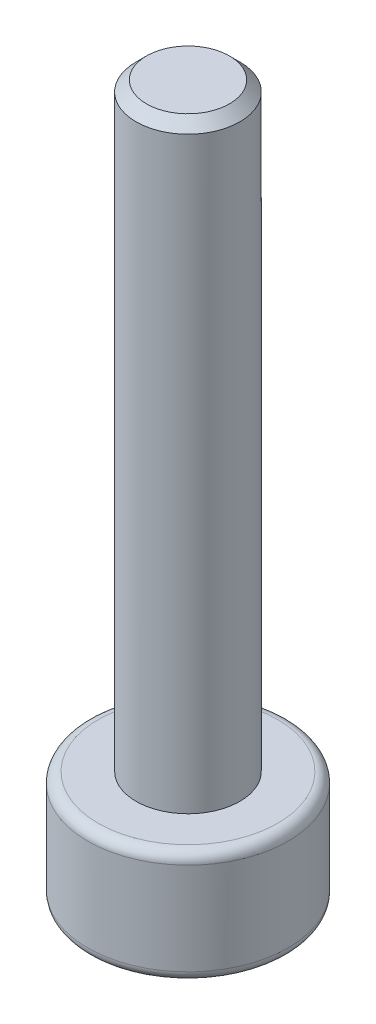
ISO-10303-21;
HEADER;
FILE_DESCRIPTION(('STEP AP214'),'2;1');
FILE_NAME('part.step','',(''),(''),'','','');
FILE_SCHEMA(('AUTOMOTIVE_DESIGN { 1 0 10303 214 1 1 1 1 }'));
ENDSEC;
DATA;
#1=APPLICATION_CONTEXT('core data for automotive mechanical design processes');
#2=APPLICATION_PROTOCOL_DEFINITION('international standard','automotive_design',2000,#1);
#3=PRODUCT_CONTEXT('',#1,'mechanical');
#4=PRODUCT('Part','Part','',(#3));
#5=PRODUCT_RELATED_PRODUCT_CATEGORY('part','',(#4));
#6=PRODUCT_DEFINITION_FORMATION('','',#4);
#7=PRODUCT_DEFINITION_CONTEXT('part definition',#1,'design');
#8=PRODUCT_DEFINITION('design','',#6,#7);
#9=PRODUCT_DEFINITION_SHAPE('','',#8);
#10=(LENGTH_UNIT() NAMED_UNIT(*) SI_UNIT(.MILLI.,.METRE.));
#11=(NAMED_UNIT(*) PLANE_ANGLE_UNIT() SI_UNIT($,.RADIAN.));
#12=(NAMED_UNIT(*) SI_UNIT($,.STERADIAN.) SOLID_ANGLE_UNIT());
#13=UNCERTAINTY_MEASURE_WITH_UNIT(LENGTH_MEASURE(1.E-05),#10,'distance_accuracy_value','');
#14=(GEOMETRIC_REPRESENTATION_CONTEXT(3) GLOBAL_UNCERTAINTY_ASSIGNED_CONTEXT((#13)) GLOBAL_UNIT_ASSIGNED_CONTEXT((#10,
#11,#12)) REPRESENTATION_CONTEXT('',''));
#15=CARTESIAN_POINT('',(0.,0.,0.));
#16=DIRECTION('',(0.,0.,1.));
#17=DIRECTION('',(1.,0.,0.));
#18=AXIS2_PLACEMENT_3D('',#15,#16,#17);
#19=CARTESIAN_POINT('',(-42.681642720605,4.49999999999991,-2.00000000000955));
#20=DIRECTION('',(0.,-1.,0.));
#21=DIRECTION('',(0.,0.,-1.));
#22=AXIS2_PLACEMENT_3D('',#19,#20,#21);
#23=PLANE('',#22);
#24=CARTESIAN_POINT('',(-42.681642720605,4.49999999999991,-2.00000000000955));
#25=DIRECTION('',(0.,-1.,0.));
#26=DIRECTION('',(0.,0.,-1.));
#27=AXIS2_PLACEMENT_3D('',#24,#25,#26);
#28=CIRCLE('',#27,4.325);
#29=CARTESIAN_POINT('',(-42.681642720605,4.49999999999991,-6.32500000000955));
#30=VERTEX_POINT('',#29);
#31=EDGE_CURVE('E37',#30,#30,#28,.T.);
#32=ORIENTED_EDGE('',*,*,#31,.T.);
#33=EDGE_LOOP('',(#32));
#34=FACE_BOUND('',#33,.T.);
#35=ADVANCED_FACE('F14',(#34),#23,.T.);
#36=CARTESIAN_POINT('',(-42.681642720605,4.49999999999991,-2.00000000000955));
#37=DIRECTION('',(0.,-1.,0.));
#38=DIRECTION('',(0.,0.,-1.));
#39=AXIS2_PLACEMENT_3D('',#36,#37,#38);
#40=CYLINDRICAL_SURFACE('',#39,4.825);
#41=CARTESIAN_POINT('',(-42.681642720605,4.99999999999991,-2.00000000000955));
#42=DIRECTION('',(0.,-1.,0.));
#43=DIRECTION('',(0.,0.,-1.));
#44=AXIS2_PLACEMENT_3D('',#41,#42,#43);
#45=CIRCLE('',#44,4.825);
#46=CARTESIAN_POINT('',(-42.681642720605,4.99999999999991,-6.82500000000955));
#47=VERTEX_POINT('',#46);
#48=EDGE_CURVE('E29',#47,#47,#45,.F.);
#49=ORIENTED_EDGE('',*,*,#48,.T.);
#50=EDGE_LOOP('',(#49));
#51=FACE_BOUND('',#50,.T.);
#52=CARTESIAN_POINT('',(-42.681642720605,9.44999999999991,-2.00000000000955));
#53=DIRECTION('',(0.,1.,0.));
#54=DIRECTION('',(0.,0.,1.));
#55=AXIS2_PLACEMENT_3D('',#52,#53,#54);
#56=CIRCLE('',#55,4.825);
#57=CARTESIAN_POINT('',(-42.681642720605,9.44999999999991,2.82499999999045));
#58=VERTEX_POINT('',#57);
#59=EDGE_CURVE('E34',#58,#58,#56,.F.);
#60=ORIENTED_EDGE('',*,*,#59,.T.);
#61=EDGE_LOOP('',(#60));
#62=FACE_BOUND('',#61,.T.);
#63=ADVANCED_FACE('F57',(#51,#62),#40,.T.);
#64=CARTESIAN_POINT('',(-37.856642720605,9.94999999999991,-2.00000000000955));
#65=DIRECTION('',(0.,1.,0.));
#66=DIRECTION('',(0.,0.,1.));
#67=AXIS2_PLACEMENT_3D('',#64,#65,#66);
#68=PLANE('',#67);
#69=CARTESIAN_POINT('',(-42.681642720605,9.94999999999991,-2.00000000000955));
#70=DIRECTION('',(0.,1.,0.));
#71=DIRECTION('',(0.,0.,1.));
#72=AXIS2_PLACEMENT_3D('',#69,#70,#71);
#73=CIRCLE('',#72,4.325);
#74=CARTESIAN_POINT('',(-42.681642720605,9.94999999999991,2.32499999999045));
#75=VERTEX_POINT('',#74);
#76=EDGE_CURVE('E25',#75,#75,#73,.T.);
#77=ORIENTED_EDGE('',*,*,#76,.T.);
#78=EDGE_LOOP('',(#77));
#79=FACE_BOUND('',#78,.T.);
#80=CARTESIAN_POINT('',(-42.681642720605,9.94999999999991,-2.00000000000955));
#81=DIRECTION('',(0.,-1.,0.));
#82=DIRECTION('',(0.,0.,-1.));
#83=AXIS2_PLACEMENT_3D('',#80,#81,#82);
#84=CIRCLE('',#83,2.5);
#85=CARTESIAN_POINT('',(-42.681642720605,9.94999999999991,-4.50000000000955));
#86=VERTEX_POINT('',#85);
#87=EDGE_CURVE('E40',#86,#86,#84,.T.);
#88=ORIENTED_EDGE('',*,*,#87,.T.);
#89=EDGE_LOOP('',(#88));
#90=FACE_BOUND('',#89,.T.);
#91=ADVANCED_FACE('F44',(#79,#90),#68,.T.);
#92=CARTESIAN_POINT('',(-42.681642720605,4.49999999999991,-2.00000000000955));
#93=DIRECTION('',(0.,-1.,0.));
#94=DIRECTION('',(0.,0.,-1.));
#95=AXIS2_PLACEMENT_3D('',#92,#93,#94);
#96=CYLINDRICAL_SURFACE('',#95,2.5);
#97=CARTESIAN_POINT('',(-42.681642720605,38.2999999999999,-2.00000000000955));
#98=DIRECTION('',(0.,1.,0.));
#99=DIRECTION('',(0.,0.,1.));
#100=AXIS2_PLACEMENT_3D('',#97,#98,#99);
#101=CIRCLE('',#100,2.5);
#102=CARTESIAN_POINT('',(-42.681642720605,38.2999999999999,0.499999999990453));
#103=VERTEX_POINT('',#102);
#104=EDGE_CURVE('E21',#103,#103,#101,.F.);
#105=ORIENTED_EDGE('',*,*,#104,.T.);
#106=EDGE_LOOP('',(#105));
#107=FACE_BOUND('',#106,.T.);
#108=ORIENTED_EDGE('',*,*,#87,.F.);
#109=EDGE_LOOP('',(#108));
#110=FACE_BOUND('',#109,.T.);
#111=ADVANCED_FACE('F46',(#107,#110),#96,.T.);
#112=CARTESIAN_POINT('',(-40.181642720605,38.7999999999999,-2.00000000000955));
#113=DIRECTION('',(0.,1.,0.));
#114=DIRECTION('',(0.,0.,1.));
#115=AXIS2_PLACEMENT_3D('',#112,#113,#114);
#116=PLANE('',#115);
#117=CARTESIAN_POINT('',(-42.681642720605,38.7999999999999,-2.00000000000955));
#118=DIRECTION('',(0.,1.,0.));
#119=DIRECTION('',(0.,0.,1.));
#120=AXIS2_PLACEMENT_3D('',#117,#118,#119);
#121=CIRCLE('',#120,2.);
#122=CARTESIAN_POINT('',(-42.681642720605,38.7999999999999,-9.54921905438333E-12));
#123=VERTEX_POINT('',#122);
#124=EDGE_CURVE('E10',#123,#123,#121,.T.);
#125=ORIENTED_EDGE('',*,*,#124,.T.);
#126=EDGE_LOOP('',(#125));
#127=FACE_BOUND('',#126,.T.);
#128=ADVANCED_FACE('F48',(#127),#116,.T.);
#129=CARTESIAN_POINT('',(-42.681642720605,4.99999999999991,-2.00000000000955));
#130=DIRECTION('',(0.,-1.,0.));
#131=DIRECTION('',(0.,0.,-1.));
#132=AXIS2_PLACEMENT_3D('',#129,#130,#131);
#133=TOROIDAL_SURFACE('',#132,4.325,0.5);
#134=ORIENTED_EDGE('',*,*,#48,.F.);
#135=EDGE_LOOP('',(#134));
#136=FACE_BOUND('',#135,.T.);
#137=ORIENTED_EDGE('',*,*,#31,.F.);
#138=EDGE_LOOP('',(#137));
#139=FACE_BOUND('',#138,.T.);
#140=ADVANCED_FACE('F55',(#136,#139),#133,.T.);
#141=CARTESIAN_POINT('',(-42.681642720605,9.44999999999991,-2.00000000000955));
#142=DIRECTION('',(0.,1.,0.));
#143=DIRECTION('',(0.,0.,1.));
#144=AXIS2_PLACEMENT_3D('',#141,#142,#143);
#145=TOROIDAL_SURFACE('',#144,4.325,0.5);
#146=ORIENTED_EDGE('',*,*,#76,.F.);
#147=EDGE_LOOP('',(#146));
#148=FACE_BOUND('',#147,.T.);
#149=ORIENTED_EDGE('',*,*,#59,.F.);
#150=EDGE_LOOP('',(#149));
#151=FACE_BOUND('',#150,.T.);
#152=ADVANCED_FACE('F70',(#148,#151),#145,.T.);
#153=CARTESIAN_POINT('',(-42.681642720605,38.2999999999999,-2.00000000000955));
#154=DIRECTION('',(0.,-1.,0.));
#155=DIRECTION('',(0.,0.,-1.));
#156=AXIS2_PLACEMENT_3D('',#153,#154,#155);
#157=CONICAL_SURFACE('',#156,2.5,0.78539816339745);
#158=ORIENTED_EDGE('',*,*,#124,.F.);
#159=EDGE_LOOP('',(#158));
#160=FACE_BOUND('',#159,.T.);
#161=ORIENTED_EDGE('',*,*,#104,.F.);
#162=EDGE_LOOP('',(#161));
#163=FACE_BOUND('',#162,.T.);
#164=ADVANCED_FACE('F16',(#160,#163),#157,.T.);
#165=CLOSED_SHELL('',(#35,#63,#91,#111,#128,#140,#152,#164));
#166=MANIFOLD_SOLID_BREP('B1',#165);
#167=ADVANCED_BREP_SHAPE_REPRESENTATION('',(#18,#166),#14);
#168=SHAPE_DEFINITION_REPRESENTATION(#9,#167);
ENDSEC;
END-ISO-10303-21;
